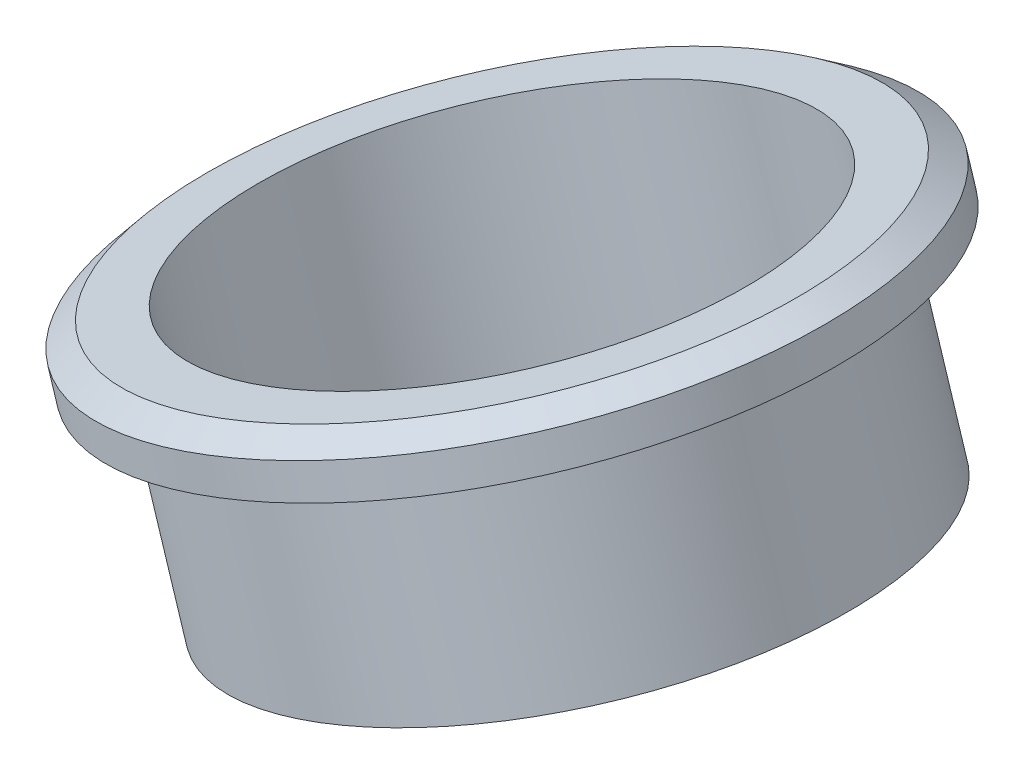
ISO-10303-21;
HEADER;
FILE_DESCRIPTION(('STEP AP214'),'2;1');
FILE_NAME('part.step','',(''),(''),'','','');
FILE_SCHEMA(('AUTOMOTIVE_DESIGN { 1 0 10303 214 1 1 1 1 }'));
ENDSEC;
DATA;
#1=APPLICATION_CONTEXT('core data for automotive mechanical design processes');
#2=APPLICATION_PROTOCOL_DEFINITION('international standard','automotive_design',2000,#1);
#3=PRODUCT_CONTEXT('',#1,'mechanical');
#4=PRODUCT('Part','Part','',(#3));
#5=PRODUCT_RELATED_PRODUCT_CATEGORY('part','',(#4));
#6=PRODUCT_DEFINITION_FORMATION('','',#4);
#7=PRODUCT_DEFINITION_CONTEXT('part definition',#1,'design');
#8=PRODUCT_DEFINITION('design','',#6,#7);
#9=PRODUCT_DEFINITION_SHAPE('','',#8);
#10=(LENGTH_UNIT() NAMED_UNIT(*) SI_UNIT(.MILLI.,.METRE.));
#11=(NAMED_UNIT(*) PLANE_ANGLE_UNIT() SI_UNIT($,.RADIAN.));
#12=(NAMED_UNIT(*) SI_UNIT($,.STERADIAN.) SOLID_ANGLE_UNIT());
#13=UNCERTAINTY_MEASURE_WITH_UNIT(LENGTH_MEASURE(1.E-05),#10,'distance_accuracy_value','');
#14=(GEOMETRIC_REPRESENTATION_CONTEXT(3) GLOBAL_UNCERTAINTY_ASSIGNED_CONTEXT((#13)) GLOBAL_UNIT_ASSIGNED_CONTEXT((#10,
#11,#12)) REPRESENTATION_CONTEXT('',''));
#15=CARTESIAN_POINT('',(0.,0.,0.));
#16=DIRECTION('',(0.,0.,1.));
#17=DIRECTION('',(1.,0.,0.));
#18=AXIS2_PLACEMENT_3D('',#15,#16,#17);
#19=CARTESIAN_POINT('',(364.894285738834,534.52971420786,0.));
#20=DIRECTION('',(-0.300714282645771,0.953714275982508,0.));
#21=DIRECTION('',(-0.953714275982508,-0.300714282645771,0.));
#22=AXIS2_PLACEMENT_3D('',#19,#20,#21);
#23=CYLINDRICAL_SURFACE('',#22,15.3);
#24=CARTESIAN_POINT('',(370.908571391749,515.45542868821,0.));
#25=DIRECTION('',(-0.300714282645771,0.953714275982508,0.));
#26=DIRECTION('',(-0.953714275982508,-0.300714282645771,0.));
#27=AXIS2_PLACEMENT_3D('',#24,#25,#26);
#28=CIRCLE('',#27,15.3);
#29=CARTESIAN_POINT('',(356.316742969217,510.85450016373,0.));
#30=VERTEX_POINT('',#29);
#31=EDGE_CURVE('E10',#30,#30,#28,.T.);
#32=ORIENTED_EDGE('',*,*,#31,.F.);
#33=EDGE_LOOP('',(#32));
#34=FACE_BOUND('',#33,.T.);
#35=CARTESIAN_POINT('',(366.397857152063,529.761142827948,0.));
#36=DIRECTION('',(-0.300714282645771,0.953714275982508,0.));
#37=DIRECTION('',(-0.953714275982508,-0.300714282645771,0.));
#38=AXIS2_PLACEMENT_3D('',#35,#36,#37);
#39=CIRCLE('',#38,15.3);
#40=CARTESIAN_POINT('',(351.80602872953,525.160214303467,0.));
#41=VERTEX_POINT('',#40);
#42=EDGE_CURVE('E58',#41,#41,#39,.T.);
#43=ORIENTED_EDGE('',*,*,#42,.T.);
#44=EDGE_LOOP('',(#43));
#45=FACE_BOUND('',#44,.T.);
#46=ADVANCED_FACE('F33',(#34,#45),#23,.F.);
#47=CARTESIAN_POINT('',(385.500399814282,520.05635721269,0.));
#48=DIRECTION('',(-0.300714282645771,0.953714275982508,0.));
#49=DIRECTION('',(-0.953714275982508,-0.300714282645771,0.));
#50=AXIS2_PLACEMENT_3D('',#47,#48,#49);
#51=PLANE('',#50);
#52=CARTESIAN_POINT('',(370.908571391749,515.45542868821,0.));
#53=DIRECTION('',(-0.300714282645771,0.953714275982508,0.));
#54=DIRECTION('',(-0.953714275982508,-0.300714282645771,0.));
#55=AXIS2_PLACEMENT_3D('',#52,#53,#54);
#56=CIRCLE('',#55,17.);
#57=CARTESIAN_POINT('',(354.695428700047,510.343285883232,0.));
#58=VERTEX_POINT('',#57);
#59=EDGE_CURVE('E39',#58,#58,#56,.T.);
#60=ORIENTED_EDGE('',*,*,#59,.F.);
#61=EDGE_LOOP('',(#60));
#62=FACE_BOUND('',#61,.T.);
#63=ORIENTED_EDGE('',*,*,#31,.T.);
#64=EDGE_LOOP('',(#63));
#65=FACE_BOUND('',#64,.T.);
#66=ADVANCED_FACE('F89',(#62,#65),#51,.F.);
#67=CARTESIAN_POINT('',(364.894285738834,534.52971420786,0.));
#68=DIRECTION('',(-0.300714282645771,0.953714275982508,0.));
#69=DIRECTION('',(-0.953714275982508,-0.300714282645771,0.));
#70=AXIS2_PLACEMENT_3D('',#67,#68,#69);
#71=CYLINDRICAL_SURFACE('',#70,17.);
#72=CARTESIAN_POINT('',(367.3,526.9,0.));
#73=DIRECTION('',(-0.300714282645771,0.953714275982508,0.));
#74=DIRECTION('',(-0.953714275982508,-0.300714282645771,0.));
#75=AXIS2_PLACEMENT_3D('',#72,#73,#74);
#76=CIRCLE('',#75,17.);
#77=CARTESIAN_POINT('',(351.086857308297,521.787857195022,0.));
#78=VERTEX_POINT('',#77);
#79=EDGE_CURVE('E43',#78,#78,#76,.T.);
#80=ORIENTED_EDGE('',*,*,#79,.F.);
#81=EDGE_LOOP('',(#80));
#82=FACE_BOUND('',#81,.T.);
#83=ORIENTED_EDGE('',*,*,#59,.T.);
#84=EDGE_LOOP('',(#83));
#85=FACE_BOUND('',#84,.T.);
#86=ADVANCED_FACE('F84',(#82,#85),#71,.T.);
#87=CARTESIAN_POINT('',(383.513142691703,532.012142804978,0.));
#88=DIRECTION('',(-0.300714282645771,0.953714275982508,0.));
#89=DIRECTION('',(-0.953714275982508,-0.300714282645771,0.));
#90=AXIS2_PLACEMENT_3D('',#87,#88,#89);
#91=PLANE('',#90);
#92=CARTESIAN_POINT('',(367.3,526.9,0.));
#93=DIRECTION('',(-0.300714282645771,0.953714275982508,0.));
#94=DIRECTION('',(-0.953714275982508,-0.300714282645771,0.));
#95=AXIS2_PLACEMENT_3D('',#92,#93,#94);
#96=CIRCLE('',#95,20.);
#97=CARTESIAN_POINT('',(348.22571448035,520.885714347085,0.));
#98=VERTEX_POINT('',#97);
#99=EDGE_CURVE('E47',#98,#98,#96,.T.);
#100=ORIENTED_EDGE('',*,*,#99,.F.);
#101=EDGE_LOOP('',(#100));
#102=FACE_BOUND('',#101,.T.);
#103=ORIENTED_EDGE('',*,*,#79,.T.);
#104=EDGE_LOOP('',(#103));
#105=FACE_BOUND('',#104,.T.);
#106=ADVANCED_FACE('F78',(#102,#105),#91,.F.);
#107=CARTESIAN_POINT('',(364.894285738834,534.52971420786,0.));
#108=DIRECTION('',(-0.300714282645771,0.953714275982508,0.));
#109=DIRECTION('',(-0.953714275982508,-0.300714282645771,0.));
#110=AXIS2_PLACEMENT_3D('',#107,#108,#109);
#111=CYLINDRICAL_SURFACE('',#110,20.);
#112=CARTESIAN_POINT('',(366.698571434708,528.807428551965,0.));
#113=DIRECTION('',(-0.300714282645771,0.953714275982508,0.));
#114=DIRECTION('',(-0.953714275982508,-0.300714282645771,0.));
#115=AXIS2_PLACEMENT_3D('',#112,#113,#114);
#116=CIRCLE('',#115,20.);
#117=CARTESIAN_POINT('',(347.624285915058,522.79314289905,0.));
#118=VERTEX_POINT('',#117);
#119=EDGE_CURVE('E52',#118,#118,#116,.T.);
#120=ORIENTED_EDGE('',*,*,#119,.F.);
#121=EDGE_LOOP('',(#120));
#122=FACE_BOUND('',#121,.T.);
#123=ORIENTED_EDGE('',*,*,#99,.T.);
#124=EDGE_LOOP('',(#123));
#125=FACE_BOUND('',#124,.T.);
#126=ADVANCED_FACE('F72',(#122,#125),#111,.T.);
#127=CARTESIAN_POINT('',(366.698571434708,528.807428551965,0.));
#128=DIRECTION('',(0.300714282645771,-0.953714275982508,0.));
#129=DIRECTION('',(0.953714275982508,0.300714282645771,0.));
#130=AXIS2_PLACEMENT_3D('',#127,#128,#129);
#131=CONICAL_SURFACE('',#130,20.,0.982793723247357);
#132=CARTESIAN_POINT('',(366.397857152063,529.761142827948,0.));
#133=DIRECTION('',(-0.300714282645771,0.953714275982508,0.));
#134=DIRECTION('',(-0.953714275982508,-0.300714282645771,0.));
#135=AXIS2_PLACEMENT_3D('',#132,#133,#134);
#136=CIRCLE('',#135,18.5);
#137=CARTESIAN_POINT('',(348.754143046386,524.197928599001,0.));
#138=VERTEX_POINT('',#137);
#139=EDGE_CURVE('E55',#138,#138,#136,.T.);
#140=ORIENTED_EDGE('',*,*,#139,.F.);
#141=EDGE_LOOP('',(#140));
#142=FACE_BOUND('',#141,.T.);
#143=ORIENTED_EDGE('',*,*,#119,.T.);
#144=EDGE_LOOP('',(#143));
#145=FACE_BOUND('',#144,.T.);
#146=ADVANCED_FACE('F66',(#142,#145),#131,.T.);
#147=CARTESIAN_POINT('',(384.041571257739,535.324357056894,0.));
#148=DIRECTION('',(0.300714282645771,-0.953714275982508,0.));
#149=DIRECTION('',(0.953714275982508,0.300714282645771,0.));
#150=AXIS2_PLACEMENT_3D('',#147,#148,#149);
#151=PLANE('',#150);
#152=ORIENTED_EDGE('',*,*,#42,.F.);
#153=EDGE_LOOP('',(#152));
#154=FACE_BOUND('',#153,.T.);
#155=ORIENTED_EDGE('',*,*,#139,.T.);
#156=EDGE_LOOP('',(#155));
#157=FACE_BOUND('',#156,.T.);
#158=ADVANCED_FACE('F63',(#154,#157),#151,.F.);
#159=CLOSED_SHELL('',(#46,#66,#86,#106,#126,#146,#158));
#160=MANIFOLD_SOLID_BREP('B2',#159);
#161=ADVANCED_BREP_SHAPE_REPRESENTATION('',(#18,#160),#14);
#162=SHAPE_DEFINITION_REPRESENTATION(#9,#161);
ENDSEC;
END-ISO-10303-21;
